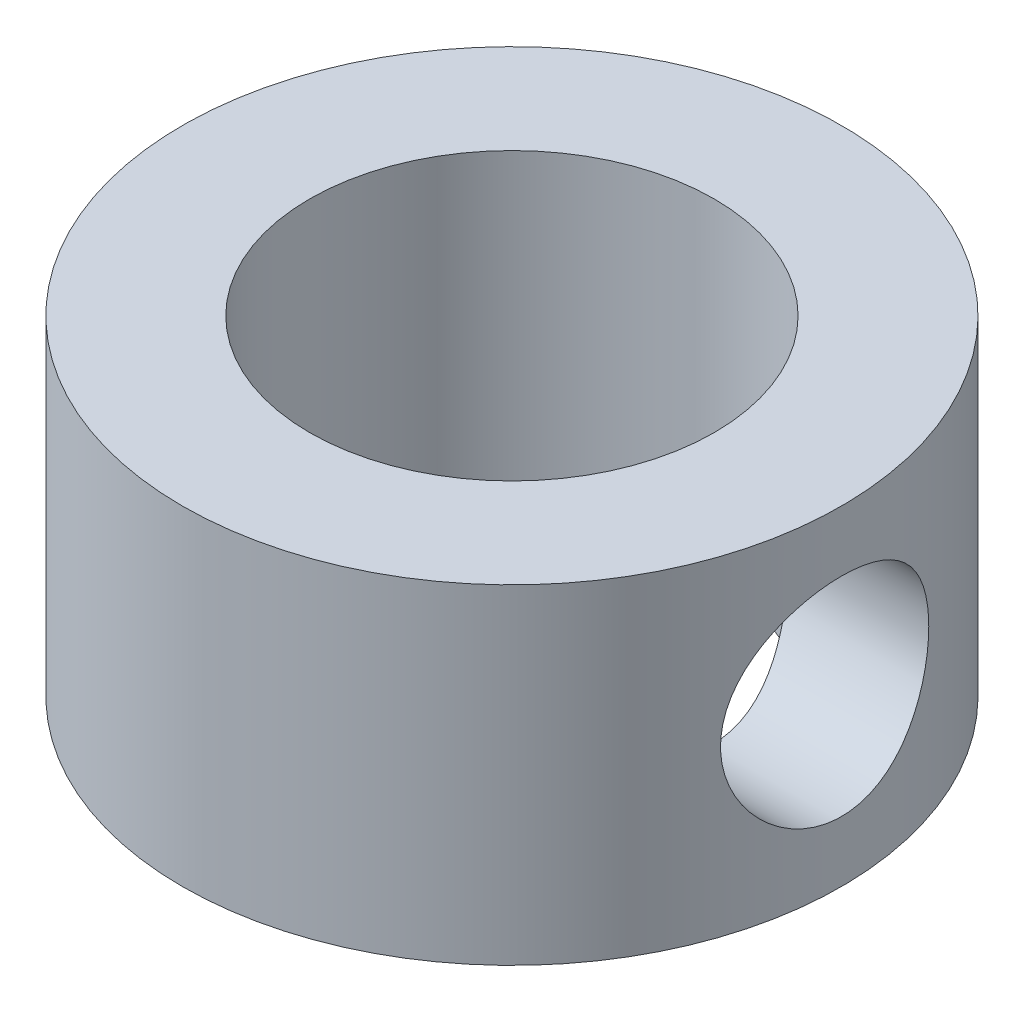
ISO-10303-21;
HEADER;
FILE_DESCRIPTION(('STEP AP214'),'2;1');
FILE_NAME('part.step','',(''),(''),'','','');
FILE_SCHEMA(('AUTOMOTIVE_DESIGN { 1 0 10303 214 1 1 1 1 }'));
ENDSEC;
DATA;
#1=APPLICATION_CONTEXT('core data for automotive mechanical design processes');
#2=APPLICATION_PROTOCOL_DEFINITION('international standard','automotive_design',2000,#1);
#3=PRODUCT_CONTEXT('',#1,'mechanical');
#4=PRODUCT('Part','Part','',(#3));
#5=PRODUCT_RELATED_PRODUCT_CATEGORY('part','',(#4));
#6=PRODUCT_DEFINITION_FORMATION('','',#4);
#7=PRODUCT_DEFINITION_CONTEXT('part definition',#1,'design');
#8=PRODUCT_DEFINITION('design','',#6,#7);
#9=PRODUCT_DEFINITION_SHAPE('','',#8);
#10=(LENGTH_UNIT() NAMED_UNIT(*) SI_UNIT(.MILLI.,.METRE.));
#11=(NAMED_UNIT(*) PLANE_ANGLE_UNIT() SI_UNIT($,.RADIAN.));
#12=(NAMED_UNIT(*) SI_UNIT($,.STERADIAN.) SOLID_ANGLE_UNIT());
#13=UNCERTAINTY_MEASURE_WITH_UNIT(LENGTH_MEASURE(1.E-05),#10,'distance_accuracy_value','');
#14=(GEOMETRIC_REPRESENTATION_CONTEXT(3) GLOBAL_UNCERTAINTY_ASSIGNED_CONTEXT((#13)) GLOBAL_UNIT_ASSIGNED_CONTEXT((#10,
#11,#12)) REPRESENTATION_CONTEXT('',''));
#15=CARTESIAN_POINT('',(0.,0.,0.));
#16=DIRECTION('',(0.,0.,1.));
#17=DIRECTION('',(1.,0.,0.));
#18=AXIS2_PLACEMENT_3D('',#15,#16,#17);
#19=CARTESIAN_POINT('',(0.,5.,-0.826021492682897));
#20=DIRECTION('',(0.,1.,0.));
#21=DIRECTION('',(0.,0.,1.));
#22=AXIS2_PLACEMENT_3D('',#19,#20,#21);
#23=PLANE('',#22);
#24=CARTESIAN_POINT('',(0.,5.,-0.826021492682897));
#25=DIRECTION('',(0.,1.,0.));
#26=DIRECTION('',(0.,0.,1.));
#27=AXIS2_PLACEMENT_3D('',#24,#25,#26);
#28=CIRCLE('',#27,5.);
#29=CARTESIAN_POINT('',(0.,5.,4.1739785073171));
#30=VERTEX_POINT('',#29);
#31=EDGE_CURVE('E10',#30,#30,#28,.T.);
#32=ORIENTED_EDGE('',*,*,#31,.T.);
#33=EDGE_LOOP('',(#32));
#34=FACE_BOUND('',#33,.T.);
#35=CARTESIAN_POINT('',(0.,5.,-0.826021492682897));
#36=DIRECTION('',(0.,1.,0.));
#37=DIRECTION('',(0.,0.,1.));
#38=AXIS2_PLACEMENT_3D('',#35,#36,#37);
#39=CIRCLE('',#38,3.07);
#40=CARTESIAN_POINT('',(0.,5.,2.2439785073171));
#41=VERTEX_POINT('',#40);
#42=EDGE_CURVE('E66',#41,#41,#39,.T.);
#43=ORIENTED_EDGE('',*,*,#42,.F.);
#44=EDGE_LOOP('',(#43));
#45=FACE_BOUND('',#44,.T.);
#46=ADVANCED_FACE('F45',(#34,#45),#23,.T.);
#47=CARTESIAN_POINT('',(0.,0.,-0.826021492682897));
#48=DIRECTION('',(0.,1.,0.));
#49=DIRECTION('',(0.,0.,1.));
#50=AXIS2_PLACEMENT_3D('',#47,#48,#49);
#51=PLANE('',#50);
#52=CARTESIAN_POINT('',(0.,0.,-0.826021492682897));
#53=DIRECTION('',(0.,1.,0.));
#54=DIRECTION('',(0.,0.,1.));
#55=AXIS2_PLACEMENT_3D('',#52,#53,#54);
#56=CIRCLE('',#55,5.);
#57=CARTESIAN_POINT('',(0.,0.,4.1739785073171));
#58=VERTEX_POINT('',#57);
#59=EDGE_CURVE('E60',#58,#58,#56,.T.);
#60=ORIENTED_EDGE('',*,*,#59,.F.);
#61=EDGE_LOOP('',(#60));
#62=FACE_BOUND('',#61,.T.);
#63=CARTESIAN_POINT('',(0.,0.,-0.826021492682897));
#64=DIRECTION('',(0.,1.,0.));
#65=DIRECTION('',(0.,0.,1.));
#66=AXIS2_PLACEMENT_3D('',#63,#64,#65);
#67=CIRCLE('',#66,3.07);
#68=CARTESIAN_POINT('',(0.,0.,2.2439785073171));
#69=VERTEX_POINT('',#68);
#70=EDGE_CURVE('E68',#69,#69,#67,.T.);
#71=ORIENTED_EDGE('',*,*,#70,.T.);
#72=EDGE_LOOP('',(#71));
#73=FACE_BOUND('',#72,.T.);
#74=ADVANCED_FACE('F92',(#62,#73),#51,.F.);
#75=CARTESIAN_POINT('',(0.,5.,-0.826021492682897));
#76=DIRECTION('',(0.,-1.,0.));
#77=DIRECTION('',(0.,0.,-1.));
#78=AXIS2_PLACEMENT_3D('',#75,#76,#77);
#79=CYLINDRICAL_SURFACE('',#78,5.);
#80=CARTESIAN_POINT('',(4.74379594839407,2.5,-2.4060214926829));
#81=CARTESIAN_POINT('',(4.74379636331953,2.41366334162142,-2.40602105958736));
#82=CARTESIAN_POINT('',(4.74617871192533,2.32732211182212,-2.39892088122878));
#83=CARTESIAN_POINT('',(4.75540738337101,2.1571797493036,-2.37079137311959));
#84=CARTESIAN_POINT('',(4.7622548327936,2.07337926322118,-2.349758528018));
#85=CARTESIAN_POINT('',(4.77956237767756,1.91080792772609,-2.294561909707));
#86=CARTESIAN_POINT('',(4.79001596578517,1.83202831935391,-2.26042177642945));
#87=CARTESIAN_POINT('',(4.81334882317688,1.68129240377162,-2.18005889501681));
#88=CARTESIAN_POINT('',(4.82622853903517,1.60933735642158,-2.1338339218323));
#89=CARTESIAN_POINT('',(4.85346992270026,1.47176525280676,-2.02887433993027));
#90=CARTESIAN_POINT('',(4.86786573299599,1.40642318307712,-1.96978807827318));
#91=CARTESIAN_POINT('',(4.89622706416507,1.28639061866649,-1.84153530735597));
#92=CARTESIAN_POINT('',(4.91019252329726,1.23170164641905,-1.77236735978838));
#93=CARTESIAN_POINT('',(4.93651094899368,1.13330865309532,-1.62393285599366));
#94=CARTESIAN_POINT('',(4.94881903660145,1.08988863367858,-1.54446938624164));
#95=CARTESIAN_POINT('',(4.9700366443251,1.01713746152703,-1.37891225924568));
#96=CARTESIAN_POINT('',(4.97894698217797,0.987802918397249,-1.29282020330719));
#97=CARTESIAN_POINT('',(4.99212344315289,0.944975903801253,-1.11932964142233));
#98=CARTESIAN_POINT('',(4.99652709272817,0.931013257311673,-1.03205783711251));
#99=CARTESIAN_POINT('',(5.00068012751333,0.917835809615348,-0.856306537117107));
#100=CARTESIAN_POINT('',(5.00043059384973,0.918617582671866,-0.76782732673562));
#101=CARTESIAN_POINT('',(4.99540071821134,0.934599295000779,-0.595485035145178));
#102=CARTESIAN_POINT('',(4.99078059795026,0.949289384001519,-0.511569248045541));
#103=CARTESIAN_POINT('',(4.97772639928949,0.991833084460593,-0.347461601660972));
#104=CARTESIAN_POINT('',(4.96929207032017,1.01968756074218,-0.267269987412591));
#105=CARTESIAN_POINT('',(4.9493438845798,1.08809196577479,-0.111720809539155));
#106=CARTESIAN_POINT('',(4.93779314180118,1.12879502153623,-0.0364355106205374));
#107=CARTESIAN_POINT('',(4.91282674620675,1.22161780772084,0.106393636386149));
#108=CARTESIAN_POINT('',(4.89941061406901,1.27374047446322,0.173935486588312));
#109=CARTESIAN_POINT('',(4.87146522310955,1.39053271835137,0.30239960993368));
#110=CARTESIAN_POINT('',(4.85691289115667,1.45564193022654,0.362917734219868));
#111=CARTESIAN_POINT('',(4.82882621833236,1.59521926123982,0.47229839543499));
#112=CARTESIAN_POINT('',(4.81529200320148,1.66968853335061,0.521159494298372));
#113=CARTESIAN_POINT('',(4.79065589493098,1.82703652386851,0.606323638615174));
#114=CARTESIAN_POINT('',(4.77958420164257,1.91000316929314,0.642473619586947));
#115=CARTESIAN_POINT('',(4.76148007517842,2.0812810542892,0.70016075454999));
#116=CARTESIAN_POINT('',(4.75444615197111,2.16959030899765,0.721703299559137));
#117=CARTESIAN_POINT('',(4.74554577292065,2.34516742435455,0.748777320763386));
#118=CARTESIAN_POINT('',(4.74347930029276,2.43232956853892,0.75492895909532));
#119=CARTESIAN_POINT('',(4.74419184096316,2.60644781893511,0.752790121745867));
#120=CARTESIAN_POINT('',(4.7469700847618,2.69340395567103,0.744501939581083));
#121=CARTESIAN_POINT('',(4.75686122380798,2.86194751049794,0.714273485035573));
#122=CARTESIAN_POINT('',(4.76384256400799,2.94361769234037,0.692747138753864));
#123=CARTESIAN_POINT('',(4.78121301258389,3.10217672062635,0.637141137129547));
#124=CARTESIAN_POINT('',(4.79160268493816,3.17906477326216,0.603059404126133));
#125=CARTESIAN_POINT('',(4.81499551671113,3.3283614945935,0.522175425959828));
#126=CARTESIAN_POINT('',(4.82806611545208,3.40057387828616,0.475030886039352));
#127=CARTESIAN_POINT('',(4.85520990646486,3.5362881511144,0.369757216395245));
#128=CARTESIAN_POINT('',(4.86928336438616,3.59978771916452,0.311625169378633));
#129=CARTESIAN_POINT('',(4.89757121837612,3.71905999768799,0.183087155463059));
#130=CARTESIAN_POINT('',(4.911766162632,3.77438935327246,0.11226439864824));
#131=CARTESIAN_POINT('',(4.93810084643692,3.87239739578937,-0.0380050045895465));
#132=CARTESIAN_POINT('',(4.95024067729116,3.91507664480777,-0.117451267627316));
#133=CARTESIAN_POINT('',(4.97102969614903,3.98616547131051,-0.28223607545659));
#134=CARTESIAN_POINT('',(4.97970374530955,4.01467705173334,-0.367527316713095));
#135=CARTESIAN_POINT('',(4.99269299443742,4.05685297901312,-0.54201767266721));
#136=CARTESIAN_POINT('',(4.99700959228268,4.07052208746723,-0.631215524530266));
#137=CARTESIAN_POINT('',(5.00070282530796,4.08223128998926,-0.806910356838091));
#138=CARTESIAN_POINT('',(5.00028166883454,4.08091110699432,-0.893360950072183));
#139=CARTESIAN_POINT('',(4.99503327522649,4.0642313112161,-1.06475256527023));
#140=CARTESIAN_POINT('',(4.99020633645733,4.04887264913732,-1.14969368906037));
#141=CARTESIAN_POINT('',(4.97675444814957,4.00496223156305,-1.3145645936501));
#142=CARTESIAN_POINT('',(4.9681798281825,3.97658506579076,-1.3945452665303));
#143=CARTESIAN_POINT('',(4.9481164445347,3.90760143408276,-1.54864768499796));
#144=CARTESIAN_POINT('',(4.9366271758085,3.86699284847839,-1.62276841226128));
#145=CARTESIAN_POINT('',(4.9114384358451,3.77308259637498,-1.76582576889807));
#146=CARTESIAN_POINT('',(4.89767646690394,3.71939190536221,-1.83449589949348));
#147=CARTESIAN_POINT('',(4.86966957543771,3.60152358377668,-1.96206365010321));
#148=CARTESIAN_POINT('',(4.85542450787698,3.53734278137894,-2.02095830348242));
#149=CARTESIAN_POINT('',(4.82748631061828,3.39769381322372,-2.12933247172507));
#150=CARTESIAN_POINT('',(4.81382856749768,3.32191537306034,-2.17842243658819));
#151=CARTESIAN_POINT('',(4.78922787996364,3.16277083389909,-2.26311994327834));
#152=CARTESIAN_POINT('',(4.77828389930904,3.07940764778377,-2.29873263409922));
#153=CARTESIAN_POINT('',(4.76119262268252,2.9142008594155,-2.35304244712836));
#154=CARTESIAN_POINT('',(4.7547356359923,2.83275389827299,-2.37285015958725));
#155=CARTESIAN_POINT('',(4.74603764745682,2.6675389851883,-2.39933818020849));
#156=CARTESIAN_POINT('',(4.74379554579582,2.58377164450764,-2.40602191291141));
#157=CARTESIAN_POINT('',(4.74379594839407,2.5,-2.4060214926829));
#158=B_SPLINE_CURVE_WITH_KNOTS('',3,(#80,#81,#82,#83,#84,#85,#86,#87,#88,#89,#90,#91,#92,#93,
#94,#95,#96,#97,#98,#99,#100,#101,#102,#103,#104,#105,#106,#107,#108,#109,#110,#111,#112,#113,
#114,#115,#116,#117,#118,#119,#120,#121,#122,#123,#124,#125,#126,#127,#128,#129,#130,#131,#132,
#133,#134,#135,#136,#137,#138,#139,#140,#141,#142,#143,#144,#145,#146,#147,#148,#149,#150,#151,
#152,#153,#154,#155,#156,#157),.UNSPECIFIED.,.T.,.F.,(4,2,2,2,2,2,2,2,2,2,2,2,2,2,2,2,2,2,2,2,2,
2,2,2,2,2,2,2,2,2,2,2,2,2,2,2,2,2,4),(0.,0.258700401850064,0.517466101269897,0.775767274180742,
1.03411603879664,1.30069625572959,1.56731454172123,1.8401127522332,2.11284526685538,
2.37698169899142,2.6410567620972,2.895811529186,3.15058303449996,3.40851341581591,
3.66651019664877,3.93548893663748,4.20450084197171,4.4766493208322,4.74869730587405,
5.00959282591479,5.27044691097669,5.52353245727833,5.77665990291002,6.03717667075641,
6.29776270582304,6.5694289550869,6.84108313151288,7.11075206829985,7.38033446730776,
7.63845626664579,7.89656058692683,8.15130036280888,8.40608430976001,8.66964407669472,
8.93328368236257,9.20591360438401,9.47843926271225,9.72951934515921,9.98053390264576),.UNSPECIFIED.);
#159=CARTESIAN_POINT('',(4.74379594839407,2.5,-2.4060214926829));
#160=VERTEX_POINT('',#159);
#161=EDGE_CURVE('E72',#160,#160,#158,.T.);
#162=ORIENTED_EDGE('',*,*,#161,.T.);
#163=EDGE_LOOP('',(#162));
#164=FACE_BOUND('',#163,.T.);
#165=ORIENTED_EDGE('',*,*,#31,.F.);
#166=EDGE_LOOP('',(#165));
#167=FACE_BOUND('',#166,.T.);
#168=ORIENTED_EDGE('',*,*,#59,.T.);
#169=EDGE_LOOP('',(#168));
#170=FACE_BOUND('',#169,.T.);
#171=ADVANCED_FACE('F47',(#164,#167,#170),#79,.T.);
#172=CARTESIAN_POINT('',(0.,5.,-0.826021492682897));
#173=DIRECTION('',(0.,-1.,0.));
#174=DIRECTION('',(0.,0.,-1.));
#175=AXIS2_PLACEMENT_3D('',#172,#173,#174);
#176=CYLINDRICAL_SURFACE('',#175,3.07);
#177=CARTESIAN_POINT('',(2.63220439935807,2.5,-2.4060214926829));
#178=CARTESIAN_POINT('',(2.63221215612725,2.41805137667025,-2.40601547777821));
#179=CARTESIAN_POINT('',(2.63609025679284,2.33600797407909,-2.39960285935602));
#180=CARTESIAN_POINT('',(2.65102912651248,2.17447028875524,-2.37429351294588));
#181=CARTESIAN_POINT('',(2.66210409493832,2.09498137207272,-2.35537210391647));
#182=CARTESIAN_POINT('',(2.68980671597123,1.94119842173605,-2.30609786799636));
#183=CARTESIAN_POINT('',(2.70640339666741,1.866878146837,-2.27580868550869));
#184=CARTESIAN_POINT('',(2.74323079738425,1.72439447398197,-2.20485360501488));
#185=CARTESIAN_POINT('',(2.76346189328546,1.65623171394884,-2.16418663352806));
#186=CARTESIAN_POINT('',(2.80744263658135,1.52140537299987,-2.06945297891134));
#187=CARTESIAN_POINT('',(2.83134525829307,1.45539726744922,-2.0145240446895));
#188=CARTESIAN_POINT('',(2.87874373209153,1.3330159088535,-1.89461524459133));
#189=CARTESIAN_POINT('',(2.90223936487087,1.2766477135394,-1.82963013643507));
#190=CARTESIAN_POINT('',(2.94821118745,1.17114089117181,-1.68570428520477));
#191=CARTESIAN_POINT('',(2.97049010533769,1.12282221768773,-1.60609347656929));
#192=CARTESIAN_POINT('',(3.00950763057675,1.04056485215398,-1.43851085610655));
#193=CARTESIAN_POINT('',(3.02624993711218,1.00661655454069,-1.35054467755076));
#194=CARTESIAN_POINT('',(3.05120105125599,0.956705403769417,-1.17570435498828));
#195=CARTESIAN_POINT('',(3.0599535638833,0.93958916558717,-1.08923884876313));
#196=CARTESIAN_POINT('',(3.0699796870579,0.920015691430889,-0.914255928699863));
#197=CARTESIAN_POINT('',(3.07125813593143,0.917548972091926,-0.825739879551215));
#198=CARTESIAN_POINT('',(3.06643704435279,0.92693149060521,-0.65789849357458));
#199=CARTESIAN_POINT('',(3.06100548476863,0.93748448700505,-0.578476837522157));
#200=CARTESIAN_POINT('',(3.044401658008,0.970267725594831,-0.422717761838015));
#201=CARTESIAN_POINT('',(3.0332289587917,0.99249884660526,-0.346380574789235));
#202=CARTESIAN_POINT('',(3.00597359430047,1.04811481026527,-0.197676101250693));
#203=CARTESIAN_POINT('',(2.98982842053296,1.08164219263749,-0.1253740568589));
#204=CARTESIAN_POINT('',(2.95405973990739,1.15868274265694,0.0127444473231449));
#205=CARTESIAN_POINT('',(2.93443501709563,1.20219940270145,0.0785586273310575));
#206=CARTESIAN_POINT('',(2.8912423366112,1.30289876338262,0.208760310386868));
#207=CARTESIAN_POINT('',(2.86747636901488,1.36100571249551,0.272367741763092));
#208=CARTESIAN_POINT('',(2.8198801132242,1.48678060225052,0.38936892216289));
#209=CARTESIAN_POINT('',(2.7960497876689,1.55445657242272,0.442754003952767));
#210=CARTESIAN_POINT('',(2.74918357918874,1.70323598109595,0.541488436798769));
#211=CARTESIAN_POINT('',(2.72632089237834,1.78494850797608,0.586010635336336));
#212=CARTESIAN_POINT('',(2.68652237180213,1.95613438276981,0.66034727597775));
#213=CARTESIAN_POINT('',(2.66958008758128,2.04559915086982,0.690177739768761));
#214=CARTESIAN_POINT('',(2.64549634711087,2.22221677827095,0.731793755639469));
#215=CARTESIAN_POINT('',(2.63767605536201,2.30897657470639,0.744837975996395));
#216=CARTESIAN_POINT('',(2.63081063034574,2.48377478689257,0.756315516155836));
#217=CARTESIAN_POINT('',(2.63175838777107,2.57181210897608,0.75476067315169));
#218=CARTESIAN_POINT('',(2.64160012674965,2.73544719055522,0.738239459504118));
#219=CARTESIAN_POINT('',(2.64953315994815,2.81127654963715,0.724894327771558));
#220=CARTESIAN_POINT('',(2.67099594439661,2.95945683517737,0.687629548815657));
#221=CARTESIAN_POINT('',(2.68452765607884,3.03180653328275,0.663706197322943));
#222=CARTESIAN_POINT('',(2.71637920242431,3.17476117351768,0.604834102967158));
#223=CARTESIAN_POINT('',(2.73488978957164,3.24513481684814,0.569430975280137));
#224=CARTESIAN_POINT('',(2.7744632334091,3.37935610001972,0.488992653721846));
#225=CARTESIAN_POINT('',(2.79552740206905,3.443200353895,0.443952499406097));
#226=CARTESIAN_POINT('',(2.84125250478136,3.57158158313479,0.338416918415069));
#227=CARTESIAN_POINT('',(2.86601486869626,3.63504662427423,0.276655511186401));
#228=CARTESIAN_POINT('',(2.91391394089276,3.75107513285817,0.1430213110376));
#229=CARTESIAN_POINT('',(2.93704999029948,3.80363419856453,0.0711444550081255));
#230=CARTESIAN_POINT('',(2.98004993756936,3.8978604794122,-0.0838172956536883));
#231=CARTESIAN_POINT('',(2.99978252569972,3.93911661422032,-0.16719125204677));
#232=CARTESIAN_POINT('',(3.03273041504612,4.00659422793236,-0.341003985223088));
#233=CARTESIAN_POINT('',(3.04595176317083,4.03282966007406,-0.431436116383969));
#234=CARTESIAN_POINT('',(3.06336935122301,4.06713927257773,-0.607522953943724));
#235=CARTESIAN_POINT('',(3.06830399313605,4.07670268367007,-0.692814719030319));
#236=CARTESIAN_POINT('',(3.07095623255744,4.08185966594491,-0.863918822693902));
#237=CARTESIAN_POINT('',(3.06867667911739,4.07745875195864,-0.94973094241097));
#238=CARTESIAN_POINT('',(3.05758405159291,4.05576193865591,-1.11287854995879));
#239=CARTESIAN_POINT('',(3.04925586497923,4.03942253072841,-1.19037799018842));
#240=CARTESIAN_POINT('',(3.02739476879604,3.99565290895884,-1.34139056387794));
#241=CARTESIAN_POINT('',(3.01386115324171,3.96822119069939,-1.4149031550788));
#242=CARTESIAN_POINT('',(2.98210716191126,3.90190726250899,-1.5592491436261));
#243=CARTESIAN_POINT('',(2.96371786542824,3.86260294630338,-1.62985030153063));
#244=CARTESIAN_POINT('',(2.92411991746719,3.77418179184675,-1.76373402724485));
#245=CARTESIAN_POINT('',(2.9029099949478,3.72506052479636,-1.82701327144267));
#246=CARTESIAN_POINT('',(2.85712601118511,3.61246837043353,-1.95144175029533));
#247=CARTESIAN_POINT('',(2.83243200550453,3.54803440099762,-2.01167751169382));
#248=CARTESIAN_POINT('',(2.7842194982678,3.40971280054356,-2.12085451835316));
#249=CARTESIAN_POINT('',(2.76070216366469,3.33581603357039,-2.16978471880428));
#250=CARTESIAN_POINT('',(2.71669452010474,3.17675910714393,-2.25673654473509));
#251=CARTESIAN_POINT('',(2.69636761103249,3.09126162217486,-2.29422939209369));
#252=CARTESIAN_POINT('',(2.66312795903169,2.91382212080334,-2.35371196163361));
#253=CARTESIAN_POINT('',(2.6501906019476,2.82190265772195,-2.37575320861687));
#254=CARTESIAN_POINT('',(2.63883451766395,2.69074044167304,-2.39493283174433));
#255=CARTESIAN_POINT('',(2.63635837734105,2.65276206613106,-2.39908371177408));
#256=CARTESIAN_POINT('',(2.63304145415415,2.57652936402908,-2.40462953553511));
#257=CARTESIAN_POINT('',(2.63220077647239,2.53827501987938,-2.40602430201132));
#258=CARTESIAN_POINT('',(2.63220439935807,2.5,-2.4060214926829));
#259=B_SPLINE_CURVE_WITH_KNOTS('',3,(#177,#178,#179,#180,#181,#182,#183,#184,#185,#186,#187,
#188,#189,#190,#191,#192,#193,#194,#195,#196,#197,#198,#199,#200,#201,#202,#203,#204,#205,#206,
#207,#208,#209,#210,#211,#212,#213,#214,#215,#216,#217,#218,#219,#220,#221,#222,#223,#224,#225,
#226,#227,#228,#229,#230,#231,#232,#233,#234,#235,#236,#237,#238,#239,#240,#241,#242,#243,#244,
#245,#246,#247,#248,#249,#250,#251,#252,#253,#254,#255,#256,#257,#258),.UNSPECIFIED.,.T.,.F.,(4,
2,2,2,2,2,2,2,2,2,2,2,2,2,2,2,2,2,2,2,2,2,2,2,2,2,2,2,2,2,2,2,2,2,2,2,2,2,2,2,4),(0.,
0.245684541096417,0.491855293936048,0.736667894091453,0.981505827986183,1.24781127702211,
1.51425602159081,1.80000978463598,2.0855722390512,2.34981850318629,2.61389368885998,
2.85367297249365,3.0934703029583,3.3364144467055,3.579443656984,3.84642809781689,
4.11363791428386,4.39960517858978,4.6852598944202,4.94793317221812,5.21039348801824,
5.44155915319835,5.67280583190439,5.91463325623292,6.15658545657232,6.43122883200122,
6.70598284098351,6.98969667681688,7.27314653188633,7.52965387952443,7.78605993915651,
8.02390549858981,8.26178332714134,8.50938181310934,8.75709225333834,9.03068620978922,
9.30454633045025,9.58962140495286,9.87374128924885,9.98848361919475,10.1032333283715),.UNSPECIFIED.);
#260=CARTESIAN_POINT('',(2.63220439935807,2.5,-2.4060214926829));
#261=VERTEX_POINT('',#260);
#262=EDGE_CURVE('E50',#261,#261,#259,.T.);
#263=ORIENTED_EDGE('',*,*,#262,.F.);
#264=EDGE_LOOP('',(#263));
#265=FACE_BOUND('',#264,.T.);
#266=ORIENTED_EDGE('',*,*,#42,.T.);
#267=EDGE_LOOP('',(#266));
#268=FACE_BOUND('',#267,.T.);
#269=ORIENTED_EDGE('',*,*,#70,.F.);
#270=EDGE_LOOP('',(#269));
#271=FACE_BOUND('',#270,.T.);
#272=ADVANCED_FACE('F84',(#265,#268,#271),#176,.F.);
#273=CARTESIAN_POINT('',(-0.491365962938164,2.5,-0.826021492682897));
#274=DIRECTION('',(1.,0.,0.));
#275=DIRECTION('',(0.,0.,-1.));
#276=AXIS2_PLACEMENT_3D('',#273,#274,#275);
#277=CYLINDRICAL_SURFACE('',#276,1.58);
#278=ORIENTED_EDGE('',*,*,#262,.T.);
#279=EDGE_LOOP('',(#278));
#280=FACE_BOUND('',#279,.T.);
#281=ORIENTED_EDGE('',*,*,#161,.F.);
#282=EDGE_LOOP('',(#281));
#283=FACE_BOUND('',#282,.T.);
#284=ADVANCED_FACE('F81',(#280,#283),#277,.F.);
#285=CLOSED_SHELL('',(#46,#74,#171,#272,#284));
#286=MANIFOLD_SOLID_BREP('B2',#285);
#287=ADVANCED_BREP_SHAPE_REPRESENTATION('',(#18,#286),#14);
#288=SHAPE_DEFINITION_REPRESENTATION(#9,#287);
ENDSEC;
END-ISO-10303-21;
